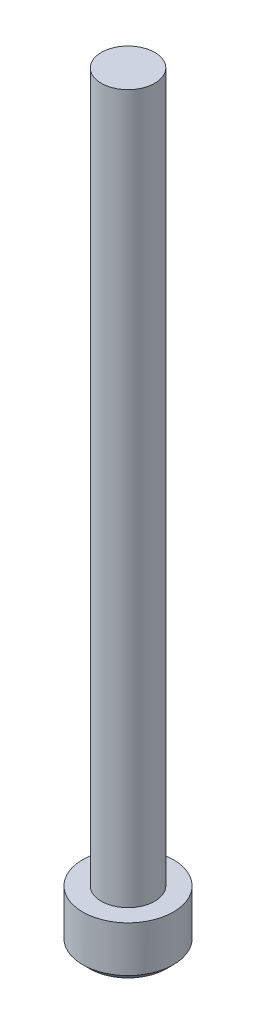
ISO-10303-21;
HEADER;
FILE_DESCRIPTION(('STEP AP214'),'2;1');
FILE_NAME('part.step','',(''),(''),'','','');
FILE_SCHEMA(('AUTOMOTIVE_DESIGN { 1 0 10303 214 1 1 1 1 }'));
ENDSEC;
DATA;
#1=APPLICATION_CONTEXT('core data for automotive mechanical design processes');
#2=APPLICATION_PROTOCOL_DEFINITION('international standard','automotive_design',2000,#1);
#3=PRODUCT_CONTEXT('',#1,'mechanical');
#4=PRODUCT('Part','Part','',(#3));
#5=PRODUCT_RELATED_PRODUCT_CATEGORY('part','',(#4));
#6=PRODUCT_DEFINITION_FORMATION('','',#4);
#7=PRODUCT_DEFINITION_CONTEXT('part definition',#1,'design');
#8=PRODUCT_DEFINITION('design','',#6,#7);
#9=PRODUCT_DEFINITION_SHAPE('','',#8);
#10=(LENGTH_UNIT() NAMED_UNIT(*) SI_UNIT(.MILLI.,.METRE.));
#11=(NAMED_UNIT(*) PLANE_ANGLE_UNIT() SI_UNIT($,.RADIAN.));
#12=(NAMED_UNIT(*) SI_UNIT($,.STERADIAN.) SOLID_ANGLE_UNIT());
#13=UNCERTAINTY_MEASURE_WITH_UNIT(LENGTH_MEASURE(1.E-05),#10,'distance_accuracy_value','');
#14=(GEOMETRIC_REPRESENTATION_CONTEXT(3) GLOBAL_UNCERTAINTY_ASSIGNED_CONTEXT((#13)) GLOBAL_UNIT_ASSIGNED_CONTEXT((#10,
#11,#12)) REPRESENTATION_CONTEXT('',''));
#15=CARTESIAN_POINT('',(0.,0.,0.));
#16=DIRECTION('',(0.,0.,1.));
#17=DIRECTION('',(1.,0.,0.));
#18=AXIS2_PLACEMENT_3D('',#15,#16,#17);
#19=CARTESIAN_POINT('',(0.,7.45,0.));
#20=DIRECTION('',(0.,-1.,0.));
#21=DIRECTION('',(0.,0.,-1.));
#22=AXIS2_PLACEMENT_3D('',#19,#20,#21);
#23=CYLINDRICAL_SURFACE('',#22,6.4);
#24=CARTESIAN_POINT('',(0.,7.45,0.));
#25=DIRECTION('',(0.,1.,0.));
#26=DIRECTION('',(0.,0.,1.));
#27=AXIS2_PLACEMENT_3D('',#24,#25,#26);
#28=CIRCLE('',#27,6.4);
#29=CARTESIAN_POINT('',(0.,7.45,6.4));
#30=VERTEX_POINT('',#29);
#31=EDGE_CURVE('E48',#30,#30,#28,.T.);
#32=ORIENTED_EDGE('',*,*,#31,.F.);
#33=EDGE_LOOP('',(#32));
#34=FACE_BOUND('',#33,.T.);
#35=CARTESIAN_POINT('',(0.,1.,0.));
#36=DIRECTION('',(0.,-1.,0.));
#37=DIRECTION('',(0.,0.,-1.));
#38=AXIS2_PLACEMENT_3D('',#35,#36,#37);
#39=CIRCLE('',#38,6.4);
#40=CARTESIAN_POINT('',(0.,1.,-6.4));
#41=VERTEX_POINT('',#40);
#42=EDGE_CURVE('E141',#41,#41,#39,.T.);
#43=ORIENTED_EDGE('',*,*,#42,.F.);
#44=EDGE_LOOP('',(#43));
#45=FACE_BOUND('',#44,.T.);
#46=ADVANCED_FACE('F45',(#34,#45),#23,.T.);
#47=CARTESIAN_POINT('',(0.,7.45,0.));
#48=DIRECTION('',(0.,1.,0.));
#49=DIRECTION('',(0.,0.,1.));
#50=AXIS2_PLACEMENT_3D('',#47,#48,#49);
#51=PLANE('',#50);
#52=CARTESIAN_POINT('',(0.,7.45,0.));
#53=DIRECTION('',(0.,1.,0.));
#54=DIRECTION('',(0.,0.,1.));
#55=AXIS2_PLACEMENT_3D('',#52,#53,#54);
#56=CIRCLE('',#55,3.775);
#57=CARTESIAN_POINT('',(0.,7.45,3.775));
#58=VERTEX_POINT('',#57);
#59=EDGE_CURVE('E11',#58,#58,#56,.T.);
#60=ORIENTED_EDGE('',*,*,#59,.F.);
#61=EDGE_LOOP('',(#60));
#62=FACE_BOUND('',#61,.T.);
#63=ORIENTED_EDGE('',*,*,#31,.T.);
#64=EDGE_LOOP('',(#63));
#65=FACE_BOUND('',#64,.T.);
#66=ADVANCED_FACE('F178',(#62,#65),#51,.T.);
#67=CARTESIAN_POINT('',(0.,107.45,0.));
#68=DIRECTION('',(0.,-1.,0.));
#69=DIRECTION('',(0.,0.,-1.));
#70=AXIS2_PLACEMENT_3D('',#67,#68,#69);
#71=CYLINDRICAL_SURFACE('',#70,3.775);
#72=CARTESIAN_POINT('',(0.,107.45,0.));
#73=DIRECTION('',(0.,1.,0.));
#74=DIRECTION('',(0.,0.,1.));
#75=AXIS2_PLACEMENT_3D('',#72,#73,#74);
#76=CIRCLE('',#75,3.775);
#77=CARTESIAN_POINT('',(0.,107.45,3.775));
#78=VERTEX_POINT('',#77);
#79=EDGE_CURVE('E160',#78,#78,#76,.T.);
#80=ORIENTED_EDGE('',*,*,#79,.F.);
#81=EDGE_LOOP('',(#80));
#82=FACE_BOUND('',#81,.T.);
#83=ORIENTED_EDGE('',*,*,#59,.T.);
#84=EDGE_LOOP('',(#83));
#85=FACE_BOUND('',#84,.T.);
#86=ADVANCED_FACE('F227',(#82,#85),#71,.T.);
#87=CARTESIAN_POINT('',(0.,107.45,0.));
#88=DIRECTION('',(0.,1.,0.));
#89=DIRECTION('',(0.,0.,1.));
#90=AXIS2_PLACEMENT_3D('',#87,#88,#89);
#91=PLANE('',#90);
#92=ORIENTED_EDGE('',*,*,#79,.T.);
#93=EDGE_LOOP('',(#92));
#94=FACE_BOUND('',#93,.T.);
#95=ADVANCED_FACE('F223',(#94),#91,.T.);
#96=CARTESIAN_POINT('',(0.,0.,0.));
#97=DIRECTION('',(0.,1.,0.));
#98=DIRECTION('',(0.,0.,1.));
#99=AXIS2_PLACEMENT_3D('',#96,#97,#98);
#100=CONICAL_SURFACE('',#99,5.4,0.785398163397448);
#101=ORIENTED_EDGE('',*,*,#42,.T.);
#102=EDGE_LOOP('',(#101));
#103=FACE_BOUND('',#102,.T.);
#104=CARTESIAN_POINT('',(0.,0.,0.));
#105=DIRECTION('',(0.,-1.,0.));
#106=DIRECTION('',(0.,0.,-1.));
#107=AXIS2_PLACEMENT_3D('',#104,#105,#106);
#108=CIRCLE('',#107,5.4);
#109=CARTESIAN_POINT('',(0.,0.,-5.4));
#110=VERTEX_POINT('',#109);
#111=EDGE_CURVE('E186',#110,#110,#108,.T.);
#112=ORIENTED_EDGE('',*,*,#111,.F.);
#113=EDGE_LOOP('',(#112));
#114=FACE_BOUND('',#113,.T.);
#115=ADVANCED_FACE('F226',(#103,#114),#100,.T.);
#116=CARTESIAN_POINT('',(0.,5.,0.));
#117=DIRECTION('',(0.,-1.,0.));
#118=DIRECTION('',(0.,0.,-1.));
#119=AXIS2_PLACEMENT_3D('',#116,#117,#118);
#120=PLANE('',#119);
#121=DIRECTION('',(-0.5,0.,-0.866025403784439));
#122=VECTOR('',#121,1.);
#123=CARTESIAN_POINT('',(-1.80421959121758,5.,3.125));
#124=LINE('',#123,#122);
#125=CARTESIAN_POINT('',(-1.80421959121758,5.,3.125));
#126=VERTEX_POINT('',#125);
#127=CARTESIAN_POINT('',(-3.60843918243516,5.,0.));
#128=VERTEX_POINT('',#127);
#129=EDGE_CURVE('E157',#126,#128,#124,.T.);
#130=ORIENTED_EDGE('',*,*,#129,.T.);
#131=DIRECTION('',(0.5,0.,-0.866025403784438));
#132=VECTOR('',#131,1.);
#133=CARTESIAN_POINT('',(-3.60843918243516,5.,0.));
#134=LINE('',#133,#132);
#135=CARTESIAN_POINT('',(-1.80421959121758,5.,-3.125));
#136=VERTEX_POINT('',#135);
#137=EDGE_CURVE('E132',#128,#136,#134,.T.);
#138=ORIENTED_EDGE('',*,*,#137,.T.);
#139=DIRECTION('',(1.,0.,0.));
#140=VECTOR('',#139,1.);
#141=CARTESIAN_POINT('',(-1.80421959121758,5.,-3.125));
#142=LINE('',#141,#140);
#143=CARTESIAN_POINT('',(1.80421959121758,5.,-3.125));
#144=VERTEX_POINT('',#143);
#145=EDGE_CURVE('E128',#136,#144,#142,.T.);
#146=ORIENTED_EDGE('',*,*,#145,.T.);
#147=DIRECTION('',(0.5,0.,0.866025403784439));
#148=VECTOR('',#147,1.);
#149=CARTESIAN_POINT('',(1.80421959121758,5.,-3.125));
#150=LINE('',#149,#148);
#151=CARTESIAN_POINT('',(3.60843918243516,5.,0.));
#152=VERTEX_POINT('',#151);
#153=EDGE_CURVE('E105',#144,#152,#150,.T.);
#154=ORIENTED_EDGE('',*,*,#153,.T.);
#155=DIRECTION('',(-0.5,0.,0.866025403784439));
#156=VECTOR('',#155,1.);
#157=CARTESIAN_POINT('',(3.60843918243516,5.,0.));
#158=LINE('',#157,#156);
#159=CARTESIAN_POINT('',(1.80421959121758,5.,3.125));
#160=VERTEX_POINT('',#159);
#161=EDGE_CURVE('E117',#152,#160,#158,.T.);
#162=ORIENTED_EDGE('',*,*,#161,.T.);
#163=DIRECTION('',(-1.,0.,0.));
#164=VECTOR('',#163,1.);
#165=CARTESIAN_POINT('',(1.80421959121758,5.,3.125));
#166=LINE('',#165,#164);
#167=EDGE_CURVE('E122',#160,#126,#166,.T.);
#168=ORIENTED_EDGE('',*,*,#167,.T.);
#169=EDGE_LOOP('',(#130,#138,#146,#154,#162,#168));
#170=FACE_BOUND('',#169,.T.);
#171=ADVANCED_FACE('F125',(#170),#120,.T.);
#172=CARTESIAN_POINT('',(-1.80421959121758,5.,-3.125));
#173=DIRECTION('',(0.,0.,-1.));
#174=DIRECTION('',(-1.,0.,0.));
#175=AXIS2_PLACEMENT_3D('',#172,#173,#174);
#176=PLANE('',#175);
#177=DIRECTION('',(1.,0.,0.));
#178=VECTOR('',#177,1.);
#179=CARTESIAN_POINT('',(-1.80421959121758,0.,-3.125));
#180=LINE('',#179,#178);
#181=CARTESIAN_POINT('',(-1.80421959121758,0.,-3.125));
#182=VERTEX_POINT('',#181);
#183=CARTESIAN_POINT('',(1.80421959121758,0.,-3.125));
#184=VERTEX_POINT('',#183);
#185=EDGE_CURVE('E145',#182,#184,#180,.T.);
#186=ORIENTED_EDGE('',*,*,#185,.T.);
#187=DIRECTION('',(0.,-1.,0.));
#188=VECTOR('',#187,1.);
#189=CARTESIAN_POINT('',(1.80421959121758,5.,-3.125));
#190=LINE('',#189,#188);
#191=EDGE_CURVE('E114',#144,#184,#190,.T.);
#192=ORIENTED_EDGE('',*,*,#191,.F.);
#193=ORIENTED_EDGE('',*,*,#145,.F.);
#194=DIRECTION('',(0.,-1.,0.));
#195=VECTOR('',#194,1.);
#196=CARTESIAN_POINT('',(-1.80421959121758,5.,-3.125));
#197=LINE('',#196,#195);
#198=EDGE_CURVE('E165',#136,#182,#197,.T.);
#199=ORIENTED_EDGE('',*,*,#198,.T.);
#200=EDGE_LOOP('',(#186,#192,#193,#199));
#201=FACE_BOUND('',#200,.T.);
#202=ADVANCED_FACE('F199',(#201),#176,.F.);
#203=CARTESIAN_POINT('',(1.80421959121758,5.,-3.125));
#204=DIRECTION('',(0.866025403784439,0.,-0.5));
#205=DIRECTION('',(-0.5,0.,-0.866025403784439));
#206=AXIS2_PLACEMENT_3D('',#203,#204,#205);
#207=PLANE('',#206);
#208=DIRECTION('',(0.5,0.,0.866025403784439));
#209=VECTOR('',#208,1.);
#210=CARTESIAN_POINT('',(1.80421959121758,0.,-3.125));
#211=LINE('',#210,#209);
#212=CARTESIAN_POINT('',(3.60843918243516,0.,0.));
#213=VERTEX_POINT('',#212);
#214=EDGE_CURVE('E108',#184,#213,#211,.T.);
#215=ORIENTED_EDGE('',*,*,#214,.T.);
#216=DIRECTION('',(0.,-1.,0.));
#217=VECTOR('',#216,1.);
#218=CARTESIAN_POINT('',(3.60843918243516,5.,0.));
#219=LINE('',#218,#217);
#220=EDGE_CURVE('E101',#152,#213,#219,.T.);
#221=ORIENTED_EDGE('',*,*,#220,.F.);
#222=ORIENTED_EDGE('',*,*,#153,.F.);
#223=ORIENTED_EDGE('',*,*,#191,.T.);
#224=EDGE_LOOP('',(#215,#221,#222,#223));
#225=FACE_BOUND('',#224,.T.);
#226=ADVANCED_FACE('F103',(#225),#207,.F.);
#227=CARTESIAN_POINT('',(3.60843918243516,5.,0.));
#228=DIRECTION('',(0.866025403784439,0.,0.5));
#229=DIRECTION('',(0.5,0.,-0.866025403784439));
#230=AXIS2_PLACEMENT_3D('',#227,#228,#229);
#231=PLANE('',#230);
#232=DIRECTION('',(-0.5,0.,0.866025403784439));
#233=VECTOR('',#232,1.);
#234=CARTESIAN_POINT('',(3.60843918243516,0.,0.));
#235=LINE('',#234,#233);
#236=CARTESIAN_POINT('',(1.80421959121758,0.,3.125));
#237=VERTEX_POINT('',#236);
#238=EDGE_CURVE('E151',#213,#237,#235,.T.);
#239=ORIENTED_EDGE('',*,*,#238,.T.);
#240=DIRECTION('',(0.,-1.,0.));
#241=VECTOR('',#240,1.);
#242=CARTESIAN_POINT('',(1.80421959121758,5.,3.125));
#243=LINE('',#242,#241);
#244=EDGE_CURVE('E113',#160,#237,#243,.T.);
#245=ORIENTED_EDGE('',*,*,#244,.F.);
#246=ORIENTED_EDGE('',*,*,#161,.F.);
#247=ORIENTED_EDGE('',*,*,#220,.T.);
#248=EDGE_LOOP('',(#239,#245,#246,#247));
#249=FACE_BOUND('',#248,.T.);
#250=ADVANCED_FACE('F118',(#249),#231,.F.);
#251=CARTESIAN_POINT('',(1.80421959121758,5.,3.125));
#252=DIRECTION('',(0.,0.,1.));
#253=DIRECTION('',(1.,0.,0.));
#254=AXIS2_PLACEMENT_3D('',#251,#252,#253);
#255=PLANE('',#254);
#256=DIRECTION('',(-1.,0.,0.));
#257=VECTOR('',#256,1.);
#258=CARTESIAN_POINT('',(1.80421959121758,0.,3.125));
#259=LINE('',#258,#257);
#260=CARTESIAN_POINT('',(-1.80421959121758,0.,3.125));
#261=VERTEX_POINT('',#260);
#262=EDGE_CURVE('E154',#237,#261,#259,.T.);
#263=ORIENTED_EDGE('',*,*,#262,.T.);
#264=DIRECTION('',(0.,-1.,0.));
#265=VECTOR('',#264,1.);
#266=CARTESIAN_POINT('',(-1.80421959121758,5.,3.125));
#267=LINE('',#266,#265);
#268=EDGE_CURVE('E68',#126,#261,#267,.T.);
#269=ORIENTED_EDGE('',*,*,#268,.F.);
#270=ORIENTED_EDGE('',*,*,#167,.F.);
#271=ORIENTED_EDGE('',*,*,#244,.T.);
#272=EDGE_LOOP('',(#263,#269,#270,#271));
#273=FACE_BOUND('',#272,.T.);
#274=ADVANCED_FACE('F204',(#273),#255,.F.);
#275=CARTESIAN_POINT('',(-1.80421959121758,5.,3.125));
#276=DIRECTION('',(-0.866025403784439,0.,0.5));
#277=DIRECTION('',(0.5,0.,0.866025403784439));
#278=AXIS2_PLACEMENT_3D('',#275,#276,#277);
#279=PLANE('',#278);
#280=DIRECTION('',(-0.5,0.,-0.866025403784439));
#281=VECTOR('',#280,1.);
#282=CARTESIAN_POINT('',(-1.80421959121758,0.,3.125));
#283=LINE('',#282,#281);
#284=CARTESIAN_POINT('',(-3.60843918243516,0.,0.));
#285=VERTEX_POINT('',#284);
#286=EDGE_CURVE('E60',#261,#285,#283,.T.);
#287=ORIENTED_EDGE('',*,*,#286,.T.);
#288=DIRECTION('',(0.,-1.,0.));
#289=VECTOR('',#288,1.);
#290=CARTESIAN_POINT('',(-3.60843918243516,5.,0.));
#291=LINE('',#290,#289);
#292=EDGE_CURVE('E90',#128,#285,#291,.T.);
#293=ORIENTED_EDGE('',*,*,#292,.F.);
#294=ORIENTED_EDGE('',*,*,#129,.F.);
#295=ORIENTED_EDGE('',*,*,#268,.T.);
#296=EDGE_LOOP('',(#287,#293,#294,#295));
#297=FACE_BOUND('',#296,.T.);
#298=ADVANCED_FACE('F206',(#297),#279,.F.);
#299=CARTESIAN_POINT('',(-3.60843918243516,5.,0.));
#300=DIRECTION('',(-0.866025403784438,0.,-0.5));
#301=DIRECTION('',(-0.5,0.,0.866025403784438));
#302=AXIS2_PLACEMENT_3D('',#299,#300,#301);
#303=PLANE('',#302);
#304=DIRECTION('',(0.5,0.,-0.866025403784438));
#305=VECTOR('',#304,1.);
#306=CARTESIAN_POINT('',(-3.60843918243516,0.,0.));
#307=LINE('',#306,#305);
#308=EDGE_CURVE('E140',#285,#182,#307,.T.);
#309=ORIENTED_EDGE('',*,*,#308,.T.);
#310=ORIENTED_EDGE('',*,*,#198,.F.);
#311=ORIENTED_EDGE('',*,*,#137,.F.);
#312=ORIENTED_EDGE('',*,*,#292,.T.);
#313=EDGE_LOOP('',(#309,#310,#311,#312));
#314=FACE_BOUND('',#313,.T.);
#315=ADVANCED_FACE('F195',(#314),#303,.F.);
#316=CARTESIAN_POINT('',(0.,0.,0.));
#317=DIRECTION('',(0.,1.,0.));
#318=DIRECTION('',(0.,0.,1.));
#319=AXIS2_PLACEMENT_3D('',#316,#317,#318);
#320=PLANE('',#319);
#321=ORIENTED_EDGE('',*,*,#308,.F.);
#322=ORIENTED_EDGE('',*,*,#286,.F.);
#323=ORIENTED_EDGE('',*,*,#262,.F.);
#324=ORIENTED_EDGE('',*,*,#238,.F.);
#325=ORIENTED_EDGE('',*,*,#214,.F.);
#326=ORIENTED_EDGE('',*,*,#185,.F.);
#327=EDGE_LOOP('',(#321,#322,#323,#324,#325,#326));
#328=FACE_BOUND('',#327,.T.);
#329=ORIENTED_EDGE('',*,*,#111,.T.);
#330=EDGE_LOOP('',(#329));
#331=FACE_BOUND('',#330,.T.);
#332=ADVANCED_FACE('F201',(#328,#331),#320,.F.);
#333=CLOSED_SHELL('',(#46,#66,#86,#95,#115,#171,#202,#226,#250,#274,#298,#315,#332));
#334=MANIFOLD_SOLID_BREP('B2',#333);
#335=ADVANCED_BREP_SHAPE_REPRESENTATION('',(#18,#334),#14);
#336=SHAPE_DEFINITION_REPRESENTATION(#9,#335);
ENDSEC;
END-ISO-10303-21;
